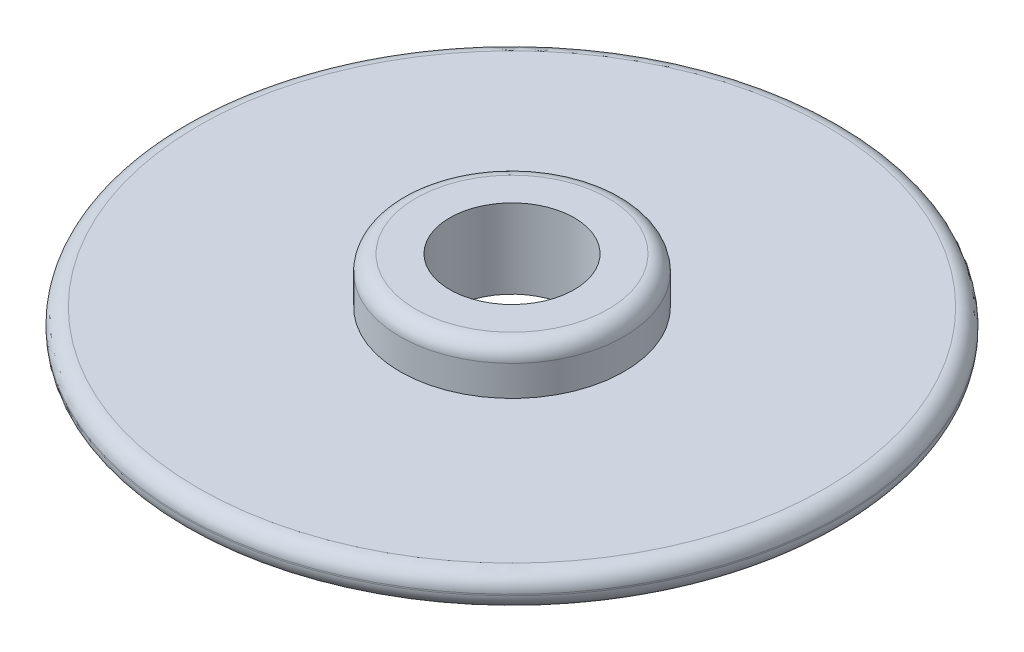
ISO-10303-21;
HEADER;
FILE_DESCRIPTION(('STEP AP214'),'2;1');
FILE_NAME('part.step','',(''),(''),'','','');
FILE_SCHEMA(('AUTOMOTIVE_DESIGN { 1 0 10303 214 1 1 1 1 }'));
ENDSEC;
DATA;
#1=APPLICATION_CONTEXT('core data for automotive mechanical design processes');
#2=APPLICATION_PROTOCOL_DEFINITION('international standard','automotive_design',2000,#1);
#3=PRODUCT_CONTEXT('',#1,'mechanical');
#4=PRODUCT('Part','Part','',(#3));
#5=PRODUCT_RELATED_PRODUCT_CATEGORY('part','',(#4));
#6=PRODUCT_DEFINITION_FORMATION('','',#4);
#7=PRODUCT_DEFINITION_CONTEXT('part definition',#1,'design');
#8=PRODUCT_DEFINITION('design','',#6,#7);
#9=PRODUCT_DEFINITION_SHAPE('','',#8);
#10=(LENGTH_UNIT() NAMED_UNIT(*) SI_UNIT(.MILLI.,.METRE.));
#11=(NAMED_UNIT(*) PLANE_ANGLE_UNIT() SI_UNIT($,.RADIAN.));
#12=(NAMED_UNIT(*) SI_UNIT($,.STERADIAN.) SOLID_ANGLE_UNIT());
#13=UNCERTAINTY_MEASURE_WITH_UNIT(LENGTH_MEASURE(1.E-05),#10,'distance_accuracy_value','');
#14=(GEOMETRIC_REPRESENTATION_CONTEXT(3) GLOBAL_UNCERTAINTY_ASSIGNED_CONTEXT((#13)) GLOBAL_UNIT_ASSIGNED_CONTEXT((#10,
#11,#12)) REPRESENTATION_CONTEXT('',''));
#15=CARTESIAN_POINT('',(0.,0.,0.));
#16=DIRECTION('',(0.,0.,1.));
#17=DIRECTION('',(1.,0.,0.));
#18=AXIS2_PLACEMENT_3D('',#15,#16,#17);
#19=CARTESIAN_POINT('',(0.,3.81,0.));
#20=DIRECTION('',(0.,1.,0.));
#21=DIRECTION('',(0.,0.,1.));
#22=AXIS2_PLACEMENT_3D('',#19,#20,#21);
#23=PLANE('',#22);
#24=CARTESIAN_POINT('',(0.,3.81,0.));
#25=DIRECTION('',(0.,1.,0.));
#26=DIRECTION('',(0.,0.,1.));
#27=AXIS2_PLACEMENT_3D('',#24,#25,#26);
#28=CIRCLE('',#27,4.6355);
#29=CARTESIAN_POINT('',(0.,3.81,4.6355));
#30=VERTEX_POINT('',#29);
#31=EDGE_CURVE('E66',#30,#30,#28,.T.);
#32=ORIENTED_EDGE('',*,*,#31,.T.);
#33=EDGE_LOOP('',(#32));
#34=FACE_BOUND('',#33,.T.);
#35=CARTESIAN_POINT('',(0.,3.81,0.));
#36=DIRECTION('',(0.,1.,0.));
#37=DIRECTION('',(0.,0.,1.));
#38=AXIS2_PLACEMENT_3D('',#35,#36,#37);
#39=CIRCLE('',#38,3.);
#40=CARTESIAN_POINT('',(0.,3.81,-3.));
#41=VERTEX_POINT('',#40);
#42=EDGE_CURVE('E70',#41,#41,#39,.T.);
#43=ORIENTED_EDGE('',*,*,#42,.F.);
#44=EDGE_LOOP('',(#43));
#45=FACE_BOUND('',#44,.T.);
#46=ADVANCED_FACE('F38',(#34,#45),#23,.T.);
#47=CARTESIAN_POINT('',(0.,3.81,0.));
#48=DIRECTION('',(0.,-1.,0.));
#49=DIRECTION('',(0.,0.,-1.));
#50=AXIS2_PLACEMENT_3D('',#47,#48,#49);
#51=CYLINDRICAL_SURFACE('',#50,15.875);
#52=CARTESIAN_POINT('',(0.,0.8255,0.));
#53=DIRECTION('',(0.,1.,0.));
#54=DIRECTION('',(0.,0.,1.));
#55=AXIS2_PLACEMENT_3D('',#52,#53,#54);
#56=CIRCLE('',#55,15.875);
#57=CARTESIAN_POINT('',(0.,0.8255,-15.875));
#58=VERTEX_POINT('',#57);
#59=EDGE_CURVE('E51',#58,#58,#56,.F.);
#60=CARTESIAN_POINT('',(0.,0.762,0.));
#61=DIRECTION('',(0.,1.,0.));
#62=DIRECTION('',(0.,0.,1.));
#63=AXIS2_PLACEMENT_3D('',#60,#61,#62);
#64=CIRCLE('',#63,15.875);
#65=CARTESIAN_POINT('',(0.,0.762,-15.875));
#66=VERTEX_POINT('',#65);
#67=EDGE_CURVE('E56',#66,#66,#64,.T.);
#68=CARTESIAN_POINT('',(0.,0.8255,-15.875));
#69=CARTESIAN_POINT('',(0.,0.824838541666667,-15.875));
#70=CARTESIAN_POINT('',(0.,0.824177083333333,-15.875));
#71=CARTESIAN_POINT('',(0.,0.822854166666667,-15.875));
#72=CARTESIAN_POINT('',(0.,0.822192708333333,-15.875));
#73=CARTESIAN_POINT('',(0.,0.820869791666667,-15.875));
#74=CARTESIAN_POINT('',(0.,0.820208333333333,-15.875));
#75=CARTESIAN_POINT('',(0.,0.818885416666667,-15.875));
#76=CARTESIAN_POINT('',(0.,0.818223958333333,-15.875));
#77=CARTESIAN_POINT('',(0.,0.816901041666666,-15.875));
#78=CARTESIAN_POINT('',(0.,0.816239583333333,-15.875));
#79=CARTESIAN_POINT('',(0.,0.814916666666667,-15.875));
#80=CARTESIAN_POINT('',(0.,0.814255208333333,-15.875));
#81=CARTESIAN_POINT('',(0.,0.812932291666666,-15.875));
#82=CARTESIAN_POINT('',(0.,0.812270833333333,-15.875));
#83=CARTESIAN_POINT('',(0.,0.810947916666666,-15.875));
#84=CARTESIAN_POINT('',(0.,0.810286458333333,-15.875));
#85=CARTESIAN_POINT('',(0.,0.808963541666666,-15.875));
#86=CARTESIAN_POINT('',(0.,0.808302083333333,-15.875));
#87=CARTESIAN_POINT('',(0.,0.806979166666666,-15.875));
#88=CARTESIAN_POINT('',(0.,0.806317708333333,-15.875));
#89=CARTESIAN_POINT('',(0.,0.804994791666667,-15.875));
#90=CARTESIAN_POINT('',(0.,0.804333333333333,-15.875));
#91=CARTESIAN_POINT('',(0.,0.803010416666666,-15.875));
#92=CARTESIAN_POINT('',(0.,0.802348958333333,-15.875));
#93=CARTESIAN_POINT('',(0.,0.801026041666666,-15.875));
#94=CARTESIAN_POINT('',(0.,0.800364583333333,-15.875));
#95=CARTESIAN_POINT('',(0.,0.799041666666666,-15.875));
#96=CARTESIAN_POINT('',(0.,0.798380208333333,-15.875));
#97=CARTESIAN_POINT('',(0.,0.797057291666666,-15.875));
#98=CARTESIAN_POINT('',(0.,0.796395833333333,-15.875));
#99=CARTESIAN_POINT('',(0.,0.795072916666666,-15.875));
#100=CARTESIAN_POINT('',(0.,0.794411458333333,-15.875));
#101=CARTESIAN_POINT('',(0.,0.793088541666666,-15.875));
#102=CARTESIAN_POINT('',(0.,0.792427083333333,-15.875));
#103=CARTESIAN_POINT('',(0.,0.791104166666666,-15.875));
#104=CARTESIAN_POINT('',(0.,0.790442708333333,-15.875));
#105=CARTESIAN_POINT('',(0.,0.789119791666666,-15.875));
#106=CARTESIAN_POINT('',(0.,0.788458333333333,-15.875));
#107=CARTESIAN_POINT('',(0.,0.787135416666666,-15.875));
#108=CARTESIAN_POINT('',(0.,0.786473958333333,-15.875));
#109=CARTESIAN_POINT('',(0.,0.785151041666666,-15.875));
#110=CARTESIAN_POINT('',(0.,0.784489583333333,-15.875));
#111=CARTESIAN_POINT('',(0.,0.783166666666666,-15.875));
#112=CARTESIAN_POINT('',(0.,0.782505208333333,-15.875));
#113=CARTESIAN_POINT('',(0.,0.781182291666666,-15.875));
#114=CARTESIAN_POINT('',(0.,0.780520833333333,-15.875));
#115=CARTESIAN_POINT('',(0.,0.779197916666666,-15.875));
#116=CARTESIAN_POINT('',(0.,0.778536458333333,-15.875));
#117=CARTESIAN_POINT('',(0.,0.777213541666666,-15.875));
#118=CARTESIAN_POINT('',(0.,0.776552083333333,-15.875));
#119=CARTESIAN_POINT('',(0.,0.775229166666666,-15.875));
#120=CARTESIAN_POINT('',(0.,0.774567708333333,-15.875));
#121=CARTESIAN_POINT('',(0.,0.773244791666666,-15.875));
#122=CARTESIAN_POINT('',(0.,0.772583333333333,-15.875));
#123=CARTESIAN_POINT('',(0.,0.771260416666666,-15.875));
#124=CARTESIAN_POINT('',(0.,0.770598958333333,-15.875));
#125=CARTESIAN_POINT('',(0.,0.769276041666666,-15.875));
#126=CARTESIAN_POINT('',(0.,0.768614583333333,-15.875));
#127=CARTESIAN_POINT('',(0.,0.767291666666666,-15.875));
#128=CARTESIAN_POINT('',(0.,0.766630208333333,-15.875));
#129=CARTESIAN_POINT('',(0.,0.765307291666666,-15.875));
#130=CARTESIAN_POINT('',(0.,0.764645833333333,-15.875));
#131=CARTESIAN_POINT('',(0.,0.763322916666666,-15.875));
#132=CARTESIAN_POINT('',(0.,0.762661458333333,-15.875));
#133=CARTESIAN_POINT('',(0.,0.762,-15.875));
#134=B_SPLINE_CURVE_WITH_KNOTS('',3,(#68,#69,#70,#71,#72,#73,#74,#75,#76,#77,#78,#79,#80,#81,
#82,#83,#84,#85,#86,#87,#88,#89,#90,#91,#92,#93,#94,#95,#96,#97,#98,#99,#100,#101,#102,#103,
#104,#105,#106,#107,#108,#109,#110,#111,#112,#113,#114,#115,#116,#117,#118,#119,#120,#121,#122,
#123,#124,#125,#126,#127,#128,#129,#130,#131,#132,#133),.UNSPECIFIED.,.F.,.F.,(4,2,2,2,2,2,2,2,
2,2,2,2,2,2,2,2,2,2,2,2,2,2,2,2,2,2,2,2,2,2,2,2,4),(0.,0.00198437499999982,0.00396875000000007,
0.00595312499999988,0.00793750000000013,0.00992187499999995,0.0119062500000002,0.013890625,
0.0158750000000003,0.0178593750000001,0.0198437499999999,0.0218281250000001,0.0238125,
0.0257968750000002,0.02778125,0.0297656250000003,0.0317500000000001,0.0337343749999999,
0.0357187500000002,0.037703125,0.0396875000000002,0.041671875,0.0436562500000003,
0.0456406250000001,0.0476249999999999,0.0496093750000002,0.05159375,0.0535781250000002,
0.0555625000000001,0.0575468750000003,0.0595312500000001,0.0615156250000004,0.0635000000000002),.UNSPECIFIED.);
#135=EDGE_CURVE('BSEAM101',#58,#66,#134,.T.);
#136=ORIENTED_EDGE('',*,*,#59,.T.);
#137=ORIENTED_EDGE('',*,*,#67,.T.);
#138=ORIENTED_EDGE('',*,*,#135,.T.);
#139=ORIENTED_EDGE('',*,*,#135,.F.);
#140=EDGE_LOOP('',(#136,#138,#137,#139));
#141=FACE_BOUND('',#140,.T.);
#142=ADVANCED_FACE('F101',(#141),#51,.T.);
#143=CARTESIAN_POINT('',(0.,0.,0.));
#144=DIRECTION('',(0.,1.,0.));
#145=DIRECTION('',(0.,0.,1.));
#146=AXIS2_PLACEMENT_3D('',#143,#144,#145);
#147=PLANE('',#146);
#148=CARTESIAN_POINT('',(0.,0.,0.));
#149=DIRECTION('',(0.,1.,0.));
#150=DIRECTION('',(0.,0.,1.));
#151=AXIS2_PLACEMENT_3D('',#148,#149,#150);
#152=CIRCLE('',#151,15.113);
#153=CARTESIAN_POINT('',(0.,0.,15.113));
#154=VERTEX_POINT('',#153);
#155=EDGE_CURVE('E11',#154,#154,#152,.F.);
#156=ORIENTED_EDGE('',*,*,#155,.T.);
#157=EDGE_LOOP('',(#156));
#158=FACE_BOUND('',#157,.T.);
#159=CARTESIAN_POINT('',(0.,0.,0.));
#160=DIRECTION('',(0.,1.,0.));
#161=DIRECTION('',(0.,0.,1.));
#162=AXIS2_PLACEMENT_3D('',#159,#160,#161);
#163=CIRCLE('',#162,3.);
#164=CARTESIAN_POINT('',(0.,0.,-3.));
#165=VERTEX_POINT('',#164);
#166=EDGE_CURVE('E71',#165,#165,#163,.T.);
#167=ORIENTED_EDGE('',*,*,#166,.T.);
#168=EDGE_LOOP('',(#167));
#169=FACE_BOUND('',#168,.T.);
#170=ADVANCED_FACE('F97',(#158,#169),#147,.F.);
#171=CARTESIAN_POINT('',(0.,3.81,0.));
#172=DIRECTION('',(0.,-1.,0.));
#173=DIRECTION('',(0.,0.,-1.));
#174=AXIS2_PLACEMENT_3D('',#171,#172,#173);
#175=CYLINDRICAL_SURFACE('',#174,3.);
#176=CARTESIAN_POINT('',(0.,3.81,-3.));
#177=CARTESIAN_POINT('',(0.,3.7703125,-3.));
#178=CARTESIAN_POINT('',(0.,3.730625,-3.));
#179=CARTESIAN_POINT('',(0.,3.65125,-3.));
#180=CARTESIAN_POINT('',(0.,3.6115625,-3.));
#181=CARTESIAN_POINT('',(0.,3.5321875,-3.));
#182=CARTESIAN_POINT('',(0.,3.4925,-3.));
#183=CARTESIAN_POINT('',(0.,3.413125,-3.));
#184=CARTESIAN_POINT('',(0.,3.3734375,-3.));
#185=CARTESIAN_POINT('',(0.,3.2940625,-3.));
#186=CARTESIAN_POINT('',(0.,3.254375,-3.));
#187=CARTESIAN_POINT('',(0.,3.175,-3.));
#188=CARTESIAN_POINT('',(0.,3.1353125,-3.));
#189=CARTESIAN_POINT('',(0.,3.0559375,-3.));
#190=CARTESIAN_POINT('',(0.,3.01625,-3.));
#191=CARTESIAN_POINT('',(0.,2.936875,-3.));
#192=CARTESIAN_POINT('',(0.,2.8971875,-3.));
#193=CARTESIAN_POINT('',(0.,2.8178125,-3.));
#194=CARTESIAN_POINT('',(0.,2.778125,-3.));
#195=CARTESIAN_POINT('',(0.,2.69875,-3.));
#196=CARTESIAN_POINT('',(0.,2.6590625,-3.));
#197=CARTESIAN_POINT('',(0.,2.5796875,-3.));
#198=CARTESIAN_POINT('',(0.,2.54,-3.));
#199=CARTESIAN_POINT('',(0.,2.460625,-3.));
#200=CARTESIAN_POINT('',(0.,2.4209375,-3.));
#201=CARTESIAN_POINT('',(0.,2.3415625,-3.));
#202=CARTESIAN_POINT('',(0.,2.301875,-3.));
#203=CARTESIAN_POINT('',(0.,2.2225,-3.));
#204=CARTESIAN_POINT('',(0.,2.1828125,-3.));
#205=CARTESIAN_POINT('',(0.,2.1034375,-3.));
#206=CARTESIAN_POINT('',(0.,2.06375,-3.));
#207=CARTESIAN_POINT('',(0.,1.984375,-3.));
#208=CARTESIAN_POINT('',(0.,1.9446875,-3.));
#209=CARTESIAN_POINT('',(0.,1.8653125,-3.));
#210=CARTESIAN_POINT('',(0.,1.825625,-3.));
#211=CARTESIAN_POINT('',(0.,1.74625,-3.));
#212=CARTESIAN_POINT('',(0.,1.7065625,-3.));
#213=CARTESIAN_POINT('',(0.,1.6271875,-3.));
#214=CARTESIAN_POINT('',(0.,1.5875,-3.));
#215=CARTESIAN_POINT('',(0.,1.508125,-3.));
#216=CARTESIAN_POINT('',(0.,1.4684375,-3.));
#217=CARTESIAN_POINT('',(0.,1.3890625,-3.));
#218=CARTESIAN_POINT('',(0.,1.349375,-3.));
#219=CARTESIAN_POINT('',(0.,1.27,-3.));
#220=CARTESIAN_POINT('',(0.,1.2303125,-3.));
#221=CARTESIAN_POINT('',(0.,1.1509375,-3.));
#222=CARTESIAN_POINT('',(0.,1.11125,-3.));
#223=CARTESIAN_POINT('',(0.,1.031875,-3.));
#224=CARTESIAN_POINT('',(0.,0.9921875,-3.));
#225=CARTESIAN_POINT('',(0.,0.9128125,-3.));
#226=CARTESIAN_POINT('',(0.,0.873125,-3.));
#227=CARTESIAN_POINT('',(0.,0.79375,-3.));
#228=CARTESIAN_POINT('',(0.,0.7540625,-3.));
#229=CARTESIAN_POINT('',(0.,0.6746875,-3.));
#230=CARTESIAN_POINT('',(0.,0.635,-3.));
#231=CARTESIAN_POINT('',(0.,0.555625,-3.));
#232=CARTESIAN_POINT('',(0.,0.5159375,-3.));
#233=CARTESIAN_POINT('',(0.,0.4365625,-3.));
#234=CARTESIAN_POINT('',(0.,0.396875,-3.));
#235=CARTESIAN_POINT('',(0.,0.3175,-3.));
#236=CARTESIAN_POINT('',(0.,0.2778125,-3.));
#237=CARTESIAN_POINT('',(0.,0.1984375,-3.));
#238=CARTESIAN_POINT('',(0.,0.15875,-3.));
#239=CARTESIAN_POINT('',(0.,0.0793749999999999,-3.));
#240=CARTESIAN_POINT('',(0.,0.0396874999999999,-3.));
#241=CARTESIAN_POINT('',(0.,0.,-3.));
#242=B_SPLINE_CURVE_WITH_KNOTS('',3,(#176,#177,#178,#179,#180,#181,#182,#183,#184,#185,#186,
#187,#188,#189,#190,#191,#192,#193,#194,#195,#196,#197,#198,#199,#200,#201,#202,#203,#204,#205,
#206,#207,#208,#209,#210,#211,#212,#213,#214,#215,#216,#217,#218,#219,#220,#221,#222,#223,#224,
#225,#226,#227,#228,#229,#230,#231,#232,#233,#234,#235,#236,#237,#238,#239,#240,#241),
.UNSPECIFIED.,.F.,.F.,(4,2,2,2,2,2,2,2,2,2,2,2,2,2,2,2,2,2,2,2,2,2,2,2,2,2,2,2,2,2,2,2,4),(0.,
0.1190625,0.238125,0.3571875,0.47625,0.595312499999999,0.714375,0.833437499999999,
0.952499999999999,1.0715625,1.190625,1.3096875,1.42875,1.5478125,1.666875,1.7859375,1.905,
2.0240625,2.143125,2.2621875,2.38125,2.5003125,2.619375,2.7384375,2.8575,2.9765625,3.095625,
3.2146875,3.33375,3.4528125,3.571875,3.6909375,3.81),.UNSPECIFIED.);
#243=EDGE_CURVE('BSEAM87',#41,#165,#242,.T.);
#244=ORIENTED_EDGE('',*,*,#42,.T.);
#245=ORIENTED_EDGE('',*,*,#166,.F.);
#246=ORIENTED_EDGE('',*,*,#243,.T.);
#247=ORIENTED_EDGE('',*,*,#243,.F.);
#248=EDGE_LOOP('',(#244,#246,#245,#247));
#249=FACE_BOUND('',#248,.T.);
#250=ADVANCED_FACE('F87',(#249),#175,.F.);
#251=CARTESIAN_POINT('',(0.,-44.9012806053458,0.));
#252=DIRECTION('',(0.,1.,0.));
#253=DIRECTION('',(0.,0.,1.));
#254=AXIS2_PLACEMENT_3D('',#251,#252,#253);
#255=CYLINDRICAL_SURFACE('',#254,5.3975);
#256=CARTESIAN_POINT('',(0.,3.048,0.));
#257=DIRECTION('',(0.,1.,0.));
#258=DIRECTION('',(0.,0.,1.));
#259=AXIS2_PLACEMENT_3D('',#256,#257,#258);
#260=CIRCLE('',#259,5.3975);
#261=CARTESIAN_POINT('',(0.,3.048,5.3975));
#262=VERTEX_POINT('',#261);
#263=EDGE_CURVE('E62',#262,#262,#260,.F.);
#264=ORIENTED_EDGE('',*,*,#263,.T.);
#265=EDGE_LOOP('',(#264));
#266=FACE_BOUND('',#265,.T.);
#267=CARTESIAN_POINT('',(0.,1.5875,0.));
#268=DIRECTION('',(0.,1.,0.));
#269=DIRECTION('',(0.,0.,1.));
#270=AXIS2_PLACEMENT_3D('',#267,#268,#269);
#271=CIRCLE('',#270,5.3975);
#272=CARTESIAN_POINT('',(0.,1.5875,5.3975));
#273=VERTEX_POINT('',#272);
#274=EDGE_CURVE('E75',#273,#273,#271,.F.);
#275=ORIENTED_EDGE('',*,*,#274,.F.);
#276=EDGE_LOOP('',(#275));
#277=FACE_BOUND('',#276,.T.);
#278=ADVANCED_FACE('F85',(#266,#277),#255,.T.);
#279=CARTESIAN_POINT('',(0.,1.5875,0.));
#280=DIRECTION('',(0.,1.,0.));
#281=DIRECTION('',(0.,0.,1.));
#282=AXIS2_PLACEMENT_3D('',#279,#280,#281);
#283=PLANE('',#282);
#284=CARTESIAN_POINT('',(0.,1.5875,0.));
#285=DIRECTION('',(0.,1.,0.));
#286=DIRECTION('',(0.,0.,1.));
#287=AXIS2_PLACEMENT_3D('',#284,#285,#286);
#288=CIRCLE('',#287,15.113);
#289=CARTESIAN_POINT('',(0.,1.5875,15.113));
#290=VERTEX_POINT('',#289);
#291=EDGE_CURVE('E46',#290,#290,#288,.T.);
#292=ORIENTED_EDGE('',*,*,#291,.T.);
#293=EDGE_LOOP('',(#292));
#294=FACE_BOUND('',#293,.T.);
#295=ORIENTED_EDGE('',*,*,#274,.T.);
#296=EDGE_LOOP('',(#295));
#297=FACE_BOUND('',#296,.T.);
#298=ADVANCED_FACE('F83',(#294,#297),#283,.T.);
#299=CARTESIAN_POINT('',(0.,3.048,0.));
#300=DIRECTION('',(0.,1.,0.));
#301=DIRECTION('',(0.,0.,1.));
#302=AXIS2_PLACEMENT_3D('',#299,#300,#301);
#303=TOROIDAL_SURFACE('',#302,4.6355,0.762);
#304=ORIENTED_EDGE('',*,*,#263,.F.);
#305=EDGE_LOOP('',(#304));
#306=FACE_BOUND('',#305,.T.);
#307=ORIENTED_EDGE('',*,*,#31,.F.);
#308=EDGE_LOOP('',(#307));
#309=FACE_BOUND('',#308,.T.);
#310=ADVANCED_FACE('F94',(#306,#309),#303,.T.);
#311=CARTESIAN_POINT('',(0.,0.8255,0.));
#312=DIRECTION('',(0.,1.,0.));
#313=DIRECTION('',(0.,0.,1.));
#314=AXIS2_PLACEMENT_3D('',#311,#312,#313);
#315=TOROIDAL_SURFACE('',#314,15.113,0.762);
#316=ORIENTED_EDGE('',*,*,#291,.F.);
#317=EDGE_LOOP('',(#316));
#318=FACE_BOUND('',#317,.T.);
#319=ORIENTED_EDGE('',*,*,#59,.F.);
#320=EDGE_LOOP('',(#319));
#321=FACE_BOUND('',#320,.T.);
#322=ADVANCED_FACE('F115',(#318,#321),#315,.T.);
#323=CARTESIAN_POINT('',(0.,0.762,0.));
#324=DIRECTION('',(0.,1.,0.));
#325=DIRECTION('',(0.,0.,1.));
#326=AXIS2_PLACEMENT_3D('',#323,#324,#325);
#327=TOROIDAL_SURFACE('',#326,15.113,0.762);
#328=ORIENTED_EDGE('',*,*,#155,.F.);
#329=EDGE_LOOP('',(#328));
#330=FACE_BOUND('',#329,.T.);
#331=ORIENTED_EDGE('',*,*,#67,.F.);
#332=EDGE_LOOP('',(#331));
#333=FACE_BOUND('',#332,.T.);
#334=ADVANCED_FACE('F40',(#330,#333),#327,.T.);
#335=CLOSED_SHELL('',(#46,#142,#170,#250,#278,#298,#310,#322,#334));
#336=MANIFOLD_SOLID_BREP('B2',#335);
#337=ADVANCED_BREP_SHAPE_REPRESENTATION('',(#18,#336),#14);
#338=SHAPE_DEFINITION_REPRESENTATION(#9,#337);
ENDSEC;
END-ISO-10303-21;
